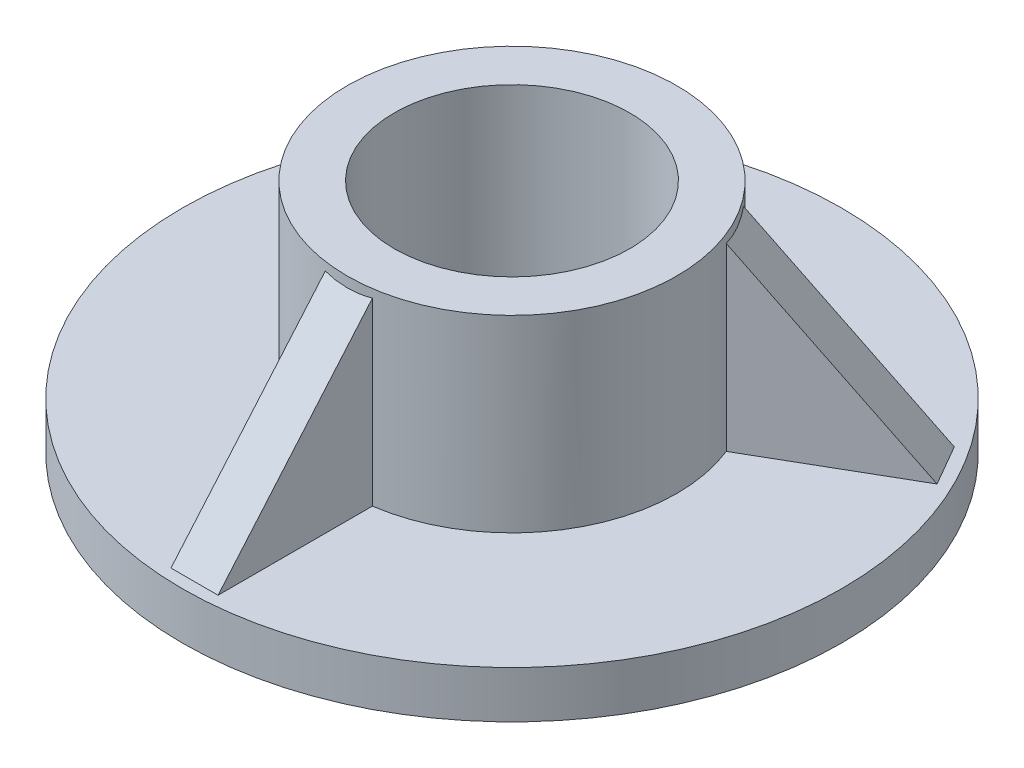
ISO-10303-21;
HEADER;
FILE_DESCRIPTION(('STEP AP214'),'2;1');
FILE_NAME('part.step','',(''),(''),'','','');
FILE_SCHEMA(('AUTOMOTIVE_DESIGN { 1 0 10303 214 1 1 1 1 }'));
ENDSEC;
DATA;
#1=APPLICATION_CONTEXT('core data for automotive mechanical design processes');
#2=APPLICATION_PROTOCOL_DEFINITION('international standard','automotive_design',2000,#1);
#3=PRODUCT_CONTEXT('',#1,'mechanical');
#4=PRODUCT('Part','Part','',(#3));
#5=PRODUCT_RELATED_PRODUCT_CATEGORY('part','',(#4));
#6=PRODUCT_DEFINITION_FORMATION('','',#4);
#7=PRODUCT_DEFINITION_CONTEXT('part definition',#1,'design');
#8=PRODUCT_DEFINITION('design','',#6,#7);
#9=PRODUCT_DEFINITION_SHAPE('','',#8);
#10=(LENGTH_UNIT() NAMED_UNIT(*) SI_UNIT(.MILLI.,.METRE.));
#11=(NAMED_UNIT(*) PLANE_ANGLE_UNIT() SI_UNIT($,.RADIAN.));
#12=(NAMED_UNIT(*) SI_UNIT($,.STERADIAN.) SOLID_ANGLE_UNIT());
#13=UNCERTAINTY_MEASURE_WITH_UNIT(LENGTH_MEASURE(1.E-05),#10,'distance_accuracy_value','');
#14=(GEOMETRIC_REPRESENTATION_CONTEXT(3) GLOBAL_UNCERTAINTY_ASSIGNED_CONTEXT((#13)) GLOBAL_UNIT_ASSIGNED_CONTEXT((#10,
#11,#12)) REPRESENTATION_CONTEXT('',''));
#15=CARTESIAN_POINT('',(0.,0.,0.));
#16=DIRECTION('',(0.,0.,1.));
#17=DIRECTION('',(1.,0.,0.));
#18=AXIS2_PLACEMENT_3D('',#15,#16,#17);
#19=CARTESIAN_POINT('',(0.,10.,0.));
#20=DIRECTION('',(0.,-1.,0.));
#21=DIRECTION('',(0.,0.,-1.));
#22=AXIS2_PLACEMENT_3D('',#19,#20,#21);
#23=CYLINDRICAL_SURFACE('',#22,70.);
#24=CARTESIAN_POINT('',(0.,0.,0.));
#25=DIRECTION('',(0.,1.,0.));
#26=DIRECTION('',(0.,0.,1.));
#27=AXIS2_PLACEMENT_3D('',#24,#25,#26);
#28=CIRCLE('',#27,70.);
#29=CARTESIAN_POINT('',(0.,0.,70.));
#30=VERTEX_POINT('',#29);
#31=EDGE_CURVE('E40',#30,#30,#28,.T.);
#32=ORIENTED_EDGE('',*,*,#31,.T.);
#33=EDGE_LOOP('',(#32));
#34=FACE_BOUND('',#33,.T.);
#35=CARTESIAN_POINT('',(0.,10.,0.));
#36=DIRECTION('',(0.,1.,0.));
#37=DIRECTION('',(0.,0.,1.));
#38=AXIS2_PLACEMENT_3D('',#35,#36,#37);
#39=CIRCLE('',#38,70.);
#40=CARTESIAN_POINT('',(0.,10.,70.));
#41=VERTEX_POINT('',#40);
#42=EDGE_CURVE('E11',#41,#41,#39,.T.);
#43=ORIENTED_EDGE('',*,*,#42,.F.);
#44=EDGE_LOOP('',(#43));
#45=FACE_BOUND('',#44,.T.);
#46=ADVANCED_FACE('F37',(#34,#45),#23,.T.);
#47=CARTESIAN_POINT('',(0.,10.,0.));
#48=DIRECTION('',(0.,1.,0.));
#49=DIRECTION('',(0.,0.,1.));
#50=AXIS2_PLACEMENT_3D('',#47,#48,#49);
#51=PLANE('',#50);
#52=ORIENTED_EDGE('',*,*,#42,.T.);
#53=EDGE_LOOP('',(#52));
#54=FACE_BOUND('',#53,.T.);
#55=DIRECTION('',(0.,0.,-1.));
#56=VECTOR('',#55,1.);
#57=CARTESIAN_POINT('',(-5.,10.,0.));
#58=LINE('',#57,#56);
#59=CARTESIAN_POINT('',(-5.,10.,67.4052941582241));
#60=VERTEX_POINT('',#59);
#61=CARTESIAN_POINT('',(-5.,10.,34.6410161513776));
#62=VERTEX_POINT('',#61);
#63=EDGE_CURVE('E167',#60,#62,#58,.T.);
#64=ORIENTED_EDGE('',*,*,#63,.T.);
#65=CARTESIAN_POINT('',(0.,10.,0.));
#66=DIRECTION('',(0.,1.,0.));
#67=DIRECTION('',(0.,0.,1.));
#68=AXIS2_PLACEMENT_3D('',#65,#66,#67);
#69=CIRCLE('',#68,35.);
#70=CARTESIAN_POINT('',(-32.4999999999999,10.,-12.9903810567667));
#71=VERTEX_POINT('',#70);
#72=EDGE_CURVE('E116',#71,#62,#69,.T.);
#73=ORIENTED_EDGE('',*,*,#72,.F.);
#74=DIRECTION('',(0.866025403784436,0.,0.500000000000004));
#75=VECTOR('',#74,1.);
#76=CARTESIAN_POINT('',(-2.50000000000002,10.,4.33012701892218));
#77=LINE('',#76,#75);
#78=CARTESIAN_POINT('',(-60.8746970905847,10.,-29.3725200601901));
#79=VERTEX_POINT('',#78);
#80=EDGE_CURVE('E151',#79,#71,#77,.T.);
#81=ORIENTED_EDGE('',*,*,#80,.F.);
#82=DIRECTION('',(-0.500000000000004,0.,0.866025403784436));
#83=VECTOR('',#82,1.);
#84=CARTESIAN_POINT('',(-58.3746970905847,10.,-33.7026470791123));
#85=LINE('',#84,#83);
#86=CARTESIAN_POINT('',(-55.8746970905847,10.,-38.0327740980345));
#87=VERTEX_POINT('',#86);
#88=EDGE_CURVE('E157',#87,#79,#85,.T.);
#89=ORIENTED_EDGE('',*,*,#88,.F.);
#90=DIRECTION('',(0.866025403784436,0.,0.500000000000004));
#91=VECTOR('',#90,1.);
#92=CARTESIAN_POINT('',(2.50000000000002,10.,-4.33012701892218));
#93=LINE('',#92,#91);
#94=CARTESIAN_POINT('',(-27.4999999999999,10.,-21.6506350946111));
#95=VERTEX_POINT('',#94);
#96=EDGE_CURVE('E145',#87,#95,#93,.T.);
#97=ORIENTED_EDGE('',*,*,#96,.T.);
#98=CARTESIAN_POINT('',(27.5000000000002,10.,-21.6506350946107));
#99=VERTEX_POINT('',#98);
#100=EDGE_CURVE('E114',#99,#95,#69,.T.);
#101=ORIENTED_EDGE('',*,*,#100,.F.);
#102=DIRECTION('',(-0.866025403784443,0.,0.499999999999992));
#103=VECTOR('',#102,1.);
#104=CARTESIAN_POINT('',(-2.49999999999996,10.,-4.33012701892222));
#105=LINE('',#104,#103);
#106=CARTESIAN_POINT('',(55.8746970905852,10.,-38.0327740980337));
#107=VERTEX_POINT('',#106);
#108=EDGE_CURVE('E52',#107,#99,#105,.T.);
#109=ORIENTED_EDGE('',*,*,#108,.F.);
#110=DIRECTION('',(-0.499999999999992,0.,-0.866025403784443));
#111=VECTOR('',#110,1.);
#112=CARTESIAN_POINT('',(58.3746970905852,10.,-33.7026470791115));
#113=LINE('',#112,#111);
#114=CARTESIAN_POINT('',(60.8746970905851,10.,-29.3725200601893));
#115=VERTEX_POINT('',#114);
#116=EDGE_CURVE('E56',#115,#107,#113,.T.);
#117=ORIENTED_EDGE('',*,*,#116,.F.);
#118=DIRECTION('',(-0.866025403784443,0.,0.499999999999992));
#119=VECTOR('',#118,1.);
#120=CARTESIAN_POINT('',(2.49999999999996,10.,4.33012701892222));
#121=LINE('',#120,#119);
#122=CARTESIAN_POINT('',(32.5000000000001,10.,-12.9903810567663));
#123=VERTEX_POINT('',#122);
#124=EDGE_CURVE('E117',#115,#123,#121,.T.);
#125=ORIENTED_EDGE('',*,*,#124,.T.);
#126=CARTESIAN_POINT('',(5.,10.,34.6410161513776));
#127=VERTEX_POINT('',#126);
#128=EDGE_CURVE('E45',#127,#123,#69,.T.);
#129=ORIENTED_EDGE('',*,*,#128,.F.);
#130=DIRECTION('',(0.,0.,-1.));
#131=VECTOR('',#130,1.);
#132=CARTESIAN_POINT('',(5.,10.,0.));
#133=LINE('',#132,#131);
#134=CARTESIAN_POINT('',(5.,10.,67.4052941582241));
#135=VERTEX_POINT('',#134);
#136=EDGE_CURVE('E171',#135,#127,#133,.T.);
#137=ORIENTED_EDGE('',*,*,#136,.F.);
#138=DIRECTION('',(1.,0.,0.));
#139=VECTOR('',#138,1.);
#140=CARTESIAN_POINT('',(0.,10.,67.4052941582241));
#141=LINE('',#140,#139);
#142=EDGE_CURVE('E176',#60,#135,#141,.T.);
#143=ORIENTED_EDGE('',*,*,#142,.F.);
#144=EDGE_LOOP('',(#64,#73,#81,#89,#97,#101,#109,#117,#125,#129,#137,#143));
#145=FACE_BOUND('',#144,.T.);
#146=ADVANCED_FACE('F119',(#54,#145),#51,.T.);
#147=CARTESIAN_POINT('',(0.,0.,0.));
#148=DIRECTION('',(0.,1.,0.));
#149=DIRECTION('',(0.,0.,1.));
#150=AXIS2_PLACEMENT_3D('',#147,#148,#149);
#151=PLANE('',#150);
#152=CARTESIAN_POINT('',(0.,0.,0.));
#153=DIRECTION('',(0.,1.,0.));
#154=DIRECTION('',(0.,0.,1.));
#155=AXIS2_PLACEMENT_3D('',#152,#153,#154);
#156=CIRCLE('',#155,25.);
#157=CARTESIAN_POINT('',(0.,0.,25.));
#158=VERTEX_POINT('',#157);
#159=EDGE_CURVE('E179',#158,#158,#156,.T.);
#160=ORIENTED_EDGE('',*,*,#159,.T.);
#161=EDGE_LOOP('',(#160));
#162=FACE_BOUND('',#161,.T.);
#163=ORIENTED_EDGE('',*,*,#31,.F.);
#164=EDGE_LOOP('',(#163));
#165=FACE_BOUND('',#164,.T.);
#166=ADVANCED_FACE('F189',(#162,#165),#151,.F.);
#167=CARTESIAN_POINT('',(0.,50.,0.));
#168=DIRECTION('',(0.,-1.,0.));
#169=DIRECTION('',(0.,0.,-1.));
#170=AXIS2_PLACEMENT_3D('',#167,#168,#169);
#171=CYLINDRICAL_SURFACE('',#170,25.);
#172=ORIENTED_EDGE('',*,*,#159,.F.);
#173=EDGE_LOOP('',(#172));
#174=FACE_BOUND('',#173,.T.);
#175=CARTESIAN_POINT('',(0.,50.,0.));
#176=DIRECTION('',(0.,1.,0.));
#177=DIRECTION('',(0.,0.,1.));
#178=AXIS2_PLACEMENT_3D('',#175,#176,#177);
#179=CIRCLE('',#178,25.);
#180=CARTESIAN_POINT('',(0.,50.,25.));
#181=VERTEX_POINT('',#180);
#182=EDGE_CURVE('E180',#181,#181,#179,.T.);
#183=ORIENTED_EDGE('',*,*,#182,.T.);
#184=EDGE_LOOP('',(#183));
#185=FACE_BOUND('',#184,.T.);
#186=ADVANCED_FACE('F192',(#174,#185),#171,.F.);
#187=CARTESIAN_POINT('',(0.,50.,0.));
#188=DIRECTION('',(0.,-1.,0.));
#189=DIRECTION('',(0.,0.,-1.));
#190=AXIS2_PLACEMENT_3D('',#187,#188,#189);
#191=CYLINDRICAL_SURFACE('',#190,35.);
#192=CARTESIAN_POINT('',(0.,50.,0.));
#193=DIRECTION('',(0.,1.,0.));
#194=DIRECTION('',(0.,0.,1.));
#195=AXIS2_PLACEMENT_3D('',#192,#193,#194);
#196=CIRCLE('',#195,35.);
#197=CARTESIAN_POINT('',(0.,50.,35.));
#198=VERTEX_POINT('',#197);
#199=EDGE_CURVE('E183',#198,#198,#196,.T.);
#200=ORIENTED_EDGE('',*,*,#199,.F.);
#201=EDGE_LOOP('',(#200));
#202=FACE_BOUND('',#201,.T.);
#203=ORIENTED_EDGE('',*,*,#72,.T.);
#204=DIRECTION('',(0.,-1.,0.));
#205=VECTOR('',#204,1.);
#206=CARTESIAN_POINT('',(-5.,50.,34.6410161513776));
#207=LINE('',#206,#205);
#208=CARTESIAN_POINT('',(-5.,48.2386760892773,34.6410161513776));
#209=VERTEX_POINT('',#208);
#210=EDGE_CURVE('E164',#209,#62,#207,.T.);
#211=ORIENTED_EDGE('',*,*,#210,.F.);
#212=CARTESIAN_POINT('',(0.,88.6676638954226,0.));
#213=DIRECTION('',(0.,0.650657077721088,0.7593716923954));
#214=DIRECTION('',(0.,-0.7593716923954,0.650657077721088));
#215=AXIS2_PLACEMENT_3D('',#212,#213,#214);
#216=ELLIPSE('',#215,53.7917763418278,35.);
#217=CARTESIAN_POINT('',(5.,48.2386760892773,34.6410161513776));
#218=VERTEX_POINT('',#217);
#219=EDGE_CURVE('E173',#209,#218,#216,.T.);
#220=ORIENTED_EDGE('',*,*,#219,.T.);
#221=DIRECTION('',(0.,-1.,0.));
#222=VECTOR('',#221,1.);
#223=CARTESIAN_POINT('',(5.,50.,34.6410161513776));
#224=LINE('',#223,#222);
#225=EDGE_CURVE('E112',#218,#127,#224,.T.);
#226=ORIENTED_EDGE('',*,*,#225,.T.);
#227=ORIENTED_EDGE('',*,*,#128,.T.);
#228=DIRECTION('',(0.,-1.,0.));
#229=VECTOR('',#228,1.);
#230=CARTESIAN_POINT('',(32.5000000000001,50.,-12.9903810567663));
#231=LINE('',#230,#229);
#232=CARTESIAN_POINT('',(32.5000000000001,48.2386760892773,-12.9903810567663));
#233=VERTEX_POINT('',#232);
#234=EDGE_CURVE('E109',#233,#123,#231,.T.);
#235=ORIENTED_EDGE('',*,*,#234,.F.);
#236=CARTESIAN_POINT('',(0.,88.6676638954226,0.));
#237=DIRECTION('',(0.657635176529203,0.650657077721088,-0.379685846197694));
#238=DIRECTION('',(0.563485558458611,-0.7593716923954,-0.325328538860539));
#239=AXIS2_PLACEMENT_3D('',#236,#237,#238);
#240=ELLIPSE('',#239,53.7917763418278,35.);
#241=CARTESIAN_POINT('',(27.5000000000002,48.2386760892773,-21.6506350946107));
#242=VERTEX_POINT('',#241);
#243=EDGE_CURVE('E134',#233,#242,#240,.T.);
#244=ORIENTED_EDGE('',*,*,#243,.T.);
#245=DIRECTION('',(0.,-1.,0.));
#246=VECTOR('',#245,1.);
#247=CARTESIAN_POINT('',(27.5000000000002,50.,-21.6506350946107));
#248=LINE('',#247,#246);
#249=EDGE_CURVE('E123',#242,#99,#248,.T.);
#250=ORIENTED_EDGE('',*,*,#249,.T.);
#251=ORIENTED_EDGE('',*,*,#100,.T.);
#252=DIRECTION('',(0.,-1.,0.));
#253=VECTOR('',#252,1.);
#254=CARTESIAN_POINT('',(-27.4999999999999,50.,-21.6506350946111));
#255=LINE('',#254,#253);
#256=CARTESIAN_POINT('',(-27.4999999999999,48.2386760892773,-21.6506350946111));
#257=VERTEX_POINT('',#256);
#258=EDGE_CURVE('E142',#257,#95,#255,.T.);
#259=ORIENTED_EDGE('',*,*,#258,.F.);
#260=CARTESIAN_POINT('',(0.,88.6676638954226,0.));
#261=DIRECTION('',(-0.657635176529197,0.650657077721088,-0.379685846197703));
#262=DIRECTION('',(-0.563485558458606,-0.7593716923954,-0.325328538860547));
#263=AXIS2_PLACEMENT_3D('',#260,#261,#262);
#264=ELLIPSE('',#263,53.7917763418278,35.);
#265=CARTESIAN_POINT('',(-32.4999999999999,48.2386760892774,-12.9903810567667));
#266=VERTEX_POINT('',#265);
#267=EDGE_CURVE('E154',#257,#266,#264,.T.);
#268=ORIENTED_EDGE('',*,*,#267,.T.);
#269=DIRECTION('',(0.,-1.,0.));
#270=VECTOR('',#269,1.);
#271=CARTESIAN_POINT('',(-32.4999999999999,50.,-12.9903810567667));
#272=LINE('',#271,#270);
#273=EDGE_CURVE('E148',#266,#71,#272,.T.);
#274=ORIENTED_EDGE('',*,*,#273,.T.);
#275=EDGE_LOOP('',(#203,#211,#220,#226,#227,#235,#244,#250,#251,#259,#268,#274));
#276=FACE_BOUND('',#275,.T.);
#277=ADVANCED_FACE('F107',(#202,#276),#191,.T.);
#278=CARTESIAN_POINT('',(0.,50.,0.));
#279=DIRECTION('',(0.,1.,0.));
#280=DIRECTION('',(0.,0.,1.));
#281=AXIS2_PLACEMENT_3D('',#278,#279,#280);
#282=PLANE('',#281);
#283=ORIENTED_EDGE('',*,*,#182,.F.);
#284=EDGE_LOOP('',(#283));
#285=FACE_BOUND('',#284,.T.);
#286=ORIENTED_EDGE('',*,*,#199,.T.);
#287=EDGE_LOOP('',(#286));
#288=FACE_BOUND('',#287,.T.);
#289=ADVANCED_FACE('F198',(#285,#288),#282,.T.);
#290=CARTESIAN_POINT('',(0.,47.819711657774,35.));
#291=DIRECTION('',(0.,0.650657077721088,0.7593716923954));
#292=DIRECTION('',(0.,-0.7593716923954,0.650657077721088));
#293=AXIS2_PLACEMENT_3D('',#290,#291,#292);
#294=PLANE('',#293);
#295=DIRECTION('',(0.,-0.7593716923954,0.650657077721088));
#296=VECTOR('',#295,1.);
#297=CARTESIAN_POINT('',(-5.,47.819711657774,35.));
#298=LINE('',#297,#296);
#299=EDGE_CURVE('E160',#209,#60,#298,.T.);
#300=ORIENTED_EDGE('',*,*,#299,.T.);
#301=ORIENTED_EDGE('',*,*,#142,.T.);
#302=DIRECTION('',(0.,-0.7593716923954,0.650657077721088));
#303=VECTOR('',#302,1.);
#304=CARTESIAN_POINT('',(5.,47.819711657774,35.));
#305=LINE('',#304,#303);
#306=EDGE_CURVE('E161',#218,#135,#305,.T.);
#307=ORIENTED_EDGE('',*,*,#306,.F.);
#308=ORIENTED_EDGE('',*,*,#219,.F.);
#309=EDGE_LOOP('',(#300,#301,#307,#308));
#310=FACE_BOUND('',#309,.T.);
#311=ADVANCED_FACE('F201',(#310),#294,.T.);
#312=CARTESIAN_POINT('',(5.,25.,0.));
#313=DIRECTION('',(1.,0.,0.));
#314=DIRECTION('',(0.,0.,-1.));
#315=AXIS2_PLACEMENT_3D('',#312,#313,#314);
#316=PLANE('',#315);
#317=ORIENTED_EDGE('',*,*,#306,.T.);
#318=ORIENTED_EDGE('',*,*,#136,.T.);
#319=ORIENTED_EDGE('',*,*,#225,.F.);
#320=EDGE_LOOP('',(#317,#318,#319));
#321=FACE_BOUND('',#320,.T.);
#322=ADVANCED_FACE('F241',(#321),#316,.T.);
#323=CARTESIAN_POINT('',(-5.,25.,0.));
#324=DIRECTION('',(1.,0.,0.));
#325=DIRECTION('',(0.,0.,-1.));
#326=AXIS2_PLACEMENT_3D('',#323,#324,#325);
#327=PLANE('',#326);
#328=ORIENTED_EDGE('',*,*,#63,.F.);
#329=ORIENTED_EDGE('',*,*,#299,.F.);
#330=ORIENTED_EDGE('',*,*,#210,.T.);
#331=EDGE_LOOP('',(#328,#329,#330));
#332=FACE_BOUND('',#331,.T.);
#333=ADVANCED_FACE('F236',(#332),#327,.F.);
#334=CARTESIAN_POINT('',(-30.3108891324553,47.819711657774,-17.5000000000001));
#335=DIRECTION('',(-0.657635176529197,0.650657077721088,-0.379685846197703));
#336=DIRECTION('',(-0.563485558458607,-0.7593716923954,-0.325328538860547));
#337=AXIS2_PLACEMENT_3D('',#334,#335,#336);
#338=PLANE('',#337);
#339=DIRECTION('',(-0.563485558458607,-0.7593716923954,-0.325328538860547));
#340=VECTOR('',#339,1.);
#341=CARTESIAN_POINT('',(-27.8108891324553,47.819711657774,-21.8301270189223));
#342=LINE('',#341,#340);
#343=EDGE_CURVE('E138',#257,#87,#342,.T.);
#344=ORIENTED_EDGE('',*,*,#343,.T.);
#345=ORIENTED_EDGE('',*,*,#88,.T.);
#346=DIRECTION('',(-0.563485558458607,-0.7593716923954,-0.325328538860547));
#347=VECTOR('',#346,1.);
#348=CARTESIAN_POINT('',(-32.8108891324553,47.819711657774,-13.169872981078));
#349=LINE('',#348,#347);
#350=EDGE_CURVE('E139',#266,#79,#349,.T.);
#351=ORIENTED_EDGE('',*,*,#350,.F.);
#352=ORIENTED_EDGE('',*,*,#267,.F.);
#353=EDGE_LOOP('',(#344,#345,#351,#352));
#354=FACE_BOUND('',#353,.T.);
#355=ADVANCED_FACE('F228',(#354),#338,.T.);
#356=CARTESIAN_POINT('',(-2.50000000000002,25.,4.33012701892218));
#357=DIRECTION('',(-0.500000000000004,0.,0.866025403784436));
#358=DIRECTION('',(0.866025403784436,0.,0.500000000000004));
#359=AXIS2_PLACEMENT_3D('',#356,#357,#358);
#360=PLANE('',#359);
#361=ORIENTED_EDGE('',*,*,#350,.T.);
#362=ORIENTED_EDGE('',*,*,#80,.T.);
#363=ORIENTED_EDGE('',*,*,#273,.F.);
#364=EDGE_LOOP('',(#361,#362,#363));
#365=FACE_BOUND('',#364,.T.);
#366=ADVANCED_FACE('F232',(#365),#360,.T.);
#367=CARTESIAN_POINT('',(2.50000000000002,25.,-4.33012701892218));
#368=DIRECTION('',(-0.500000000000004,0.,0.866025403784436));
#369=DIRECTION('',(0.866025403784436,0.,0.500000000000004));
#370=AXIS2_PLACEMENT_3D('',#367,#368,#369);
#371=PLANE('',#370);
#372=ORIENTED_EDGE('',*,*,#96,.F.);
#373=ORIENTED_EDGE('',*,*,#343,.F.);
#374=ORIENTED_EDGE('',*,*,#258,.T.);
#375=EDGE_LOOP('',(#372,#373,#374));
#376=FACE_BOUND('',#375,.T.);
#377=ADVANCED_FACE('F226',(#376),#371,.F.);
#378=CARTESIAN_POINT('',(30.3108891324555,47.819711657774,-17.4999999999997));
#379=DIRECTION('',(0.657635176529203,0.650657077721088,-0.379685846197694));
#380=DIRECTION('',(0.563485558458611,-0.7593716923954,-0.325328538860539));
#381=AXIS2_PLACEMENT_3D('',#378,#379,#380);
#382=PLANE('',#381);
#383=DIRECTION('',(0.563485558458611,-0.7593716923954,-0.325328538860539));
#384=VECTOR('',#383,1.);
#385=CARTESIAN_POINT('',(32.8108891324555,47.819711657774,-13.1698729810775));
#386=LINE('',#385,#384);
#387=EDGE_CURVE('E126',#233,#115,#386,.T.);
#388=ORIENTED_EDGE('',*,*,#387,.T.);
#389=ORIENTED_EDGE('',*,*,#116,.T.);
#390=DIRECTION('',(0.563485558458611,-0.7593716923954,-0.325328538860539));
#391=VECTOR('',#390,1.);
#392=CARTESIAN_POINT('',(27.8108891324556,47.819711657774,-21.8301270189219));
#393=LINE('',#392,#391);
#394=EDGE_CURVE('E127',#242,#107,#393,.T.);
#395=ORIENTED_EDGE('',*,*,#394,.F.);
#396=ORIENTED_EDGE('',*,*,#243,.F.);
#397=EDGE_LOOP('',(#388,#389,#395,#396));
#398=FACE_BOUND('',#397,.T.);
#399=ADVANCED_FACE('F255',(#398),#382,.T.);
#400=CARTESIAN_POINT('',(-2.49999999999996,25.,-4.33012701892222));
#401=DIRECTION('',(-0.499999999999992,0.,-0.866025403784443));
#402=DIRECTION('',(-0.866025403784443,0.,0.499999999999992));
#403=AXIS2_PLACEMENT_3D('',#400,#401,#402);
#404=PLANE('',#403);
#405=ORIENTED_EDGE('',*,*,#394,.T.);
#406=ORIENTED_EDGE('',*,*,#108,.T.);
#407=ORIENTED_EDGE('',*,*,#249,.F.);
#408=EDGE_LOOP('',(#405,#406,#407));
#409=FACE_BOUND('',#408,.T.);
#410=ADVANCED_FACE('F260',(#409),#404,.T.);
#411=CARTESIAN_POINT('',(2.49999999999996,25.,4.33012701892222));
#412=DIRECTION('',(-0.499999999999992,0.,-0.866025403784443));
#413=DIRECTION('',(-0.866025403784443,0.,0.499999999999992));
#414=AXIS2_PLACEMENT_3D('',#411,#412,#413);
#415=PLANE('',#414);
#416=ORIENTED_EDGE('',*,*,#124,.F.);
#417=ORIENTED_EDGE('',*,*,#387,.F.);
#418=ORIENTED_EDGE('',*,*,#234,.T.);
#419=EDGE_LOOP('',(#416,#417,#418));
#420=FACE_BOUND('',#419,.T.);
#421=ADVANCED_FACE('F125',(#420),#415,.F.);
#422=CLOSED_SHELL('',(#46,#146,#166,#186,#277,#289,#311,#322,#333,#355,#366,#377,#399,#410,#421));
#423=MANIFOLD_SOLID_BREP('B2',#422);
#424=ADVANCED_BREP_SHAPE_REPRESENTATION('',(#18,#423),#14);
#425=SHAPE_DEFINITION_REPRESENTATION(#9,#424);
ENDSEC;
END-ISO-10303-21;
